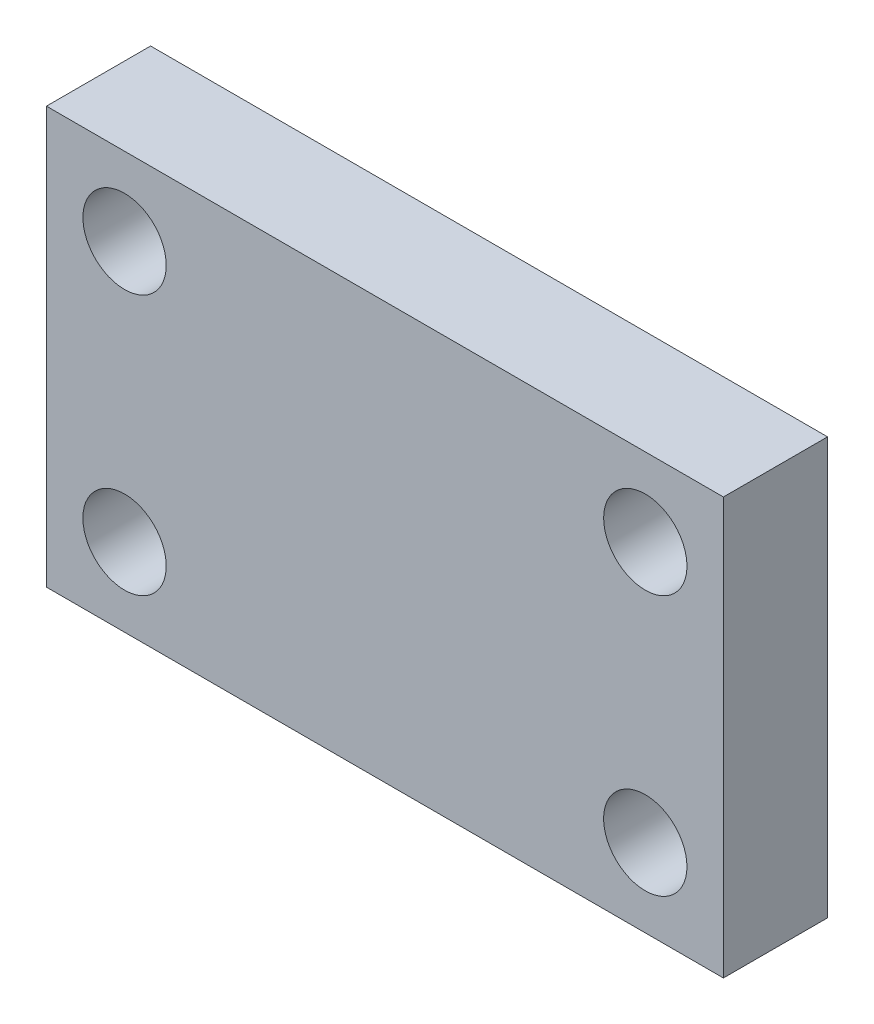
ISO-10303-21;
HEADER;
FILE_DESCRIPTION(('STEP AP214'),'2;1');
FILE_NAME('part.step','',(''),(''),'','','');
FILE_SCHEMA(('AUTOMOTIVE_DESIGN { 1 0 10303 214 1 1 1 1 }'));
ENDSEC;
DATA;
#1=APPLICATION_CONTEXT('core data for automotive mechanical design processes');
#2=APPLICATION_PROTOCOL_DEFINITION('international standard','automotive_design',2000,#1);
#3=PRODUCT_CONTEXT('',#1,'mechanical');
#4=PRODUCT('Part','Part','',(#3));
#5=PRODUCT_RELATED_PRODUCT_CATEGORY('part','',(#4));
#6=PRODUCT_DEFINITION_FORMATION('','',#4);
#7=PRODUCT_DEFINITION_CONTEXT('part definition',#1,'design');
#8=PRODUCT_DEFINITION('design','',#6,#7);
#9=PRODUCT_DEFINITION_SHAPE('','',#8);
#10=(LENGTH_UNIT() NAMED_UNIT(*) SI_UNIT(.MILLI.,.METRE.));
#11=(NAMED_UNIT(*) PLANE_ANGLE_UNIT() SI_UNIT($,.RADIAN.));
#12=(NAMED_UNIT(*) SI_UNIT($,.STERADIAN.) SOLID_ANGLE_UNIT());
#13=UNCERTAINTY_MEASURE_WITH_UNIT(LENGTH_MEASURE(1.E-05),#10,'distance_accuracy_value','');
#14=(GEOMETRIC_REPRESENTATION_CONTEXT(3) GLOBAL_UNCERTAINTY_ASSIGNED_CONTEXT((#13)) GLOBAL_UNIT_ASSIGNED_CONTEXT((#10,
#11,#12)) REPRESENTATION_CONTEXT('',''));
#15=CARTESIAN_POINT('',(0.,0.,0.));
#16=DIRECTION('',(0.,0.,1.));
#17=DIRECTION('',(1.,0.,0.));
#18=AXIS2_PLACEMENT_3D('',#15,#16,#17);
#19=CARTESIAN_POINT('',(0.,0.,20.));
#20=DIRECTION('',(0.,0.,-1.));
#21=DIRECTION('',(-1.,0.,0.));
#22=AXIS2_PLACEMENT_3D('',#19,#20,#21);
#23=PLANE('',#22);
#24=DIRECTION('',(0.,1.,0.));
#25=VECTOR('',#24,1.);
#26=CARTESIAN_POINT('',(65.,-40.,20.));
#27=LINE('',#26,#25);
#28=CARTESIAN_POINT('',(65.,-40.,20.));
#29=VERTEX_POINT('',#28);
#30=CARTESIAN_POINT('',(65.,40.,20.));
#31=VERTEX_POINT('',#30);
#32=EDGE_CURVE('E92',#29,#31,#27,.T.);
#33=ORIENTED_EDGE('',*,*,#32,.T.);
#34=DIRECTION('',(-1.,0.,0.));
#35=VECTOR('',#34,1.);
#36=CARTESIAN_POINT('',(-65.,40.,20.));
#37=LINE('',#36,#35);
#38=CARTESIAN_POINT('',(-65.,40.,20.));
#39=VERTEX_POINT('',#38);
#40=EDGE_CURVE('E87',#31,#39,#37,.T.);
#41=ORIENTED_EDGE('',*,*,#40,.T.);
#42=DIRECTION('',(0.,-1.,0.));
#43=VECTOR('',#42,1.);
#44=CARTESIAN_POINT('',(-65.,-40.,20.));
#45=LINE('',#44,#43);
#46=CARTESIAN_POINT('',(-65.,-40.,20.));
#47=VERTEX_POINT('',#46);
#48=EDGE_CURVE('E90',#39,#47,#45,.T.);
#49=ORIENTED_EDGE('',*,*,#48,.T.);
#50=DIRECTION('',(1.,0.,0.));
#51=VECTOR('',#50,1.);
#52=CARTESIAN_POINT('',(-65.,-40.,20.));
#53=LINE('',#52,#51);
#54=EDGE_CURVE('E57',#47,#29,#53,.T.);
#55=ORIENTED_EDGE('',*,*,#54,.T.);
#56=EDGE_LOOP('',(#33,#41,#49,#55));
#57=FACE_BOUND('',#56,.T.);
#58=CARTESIAN_POINT('',(-50.,25.,20.));
#59=DIRECTION('',(0.,0.,1.));
#60=DIRECTION('',(1.,0.,0.));
#61=AXIS2_PLACEMENT_3D('',#58,#59,#60);
#62=CIRCLE('',#61,8.);
#63=CARTESIAN_POINT('',(-42.,25.,20.));
#64=VERTEX_POINT('',#63);
#65=EDGE_CURVE('E112',#64,#64,#62,.T.);
#66=ORIENTED_EDGE('',*,*,#65,.F.);
#67=EDGE_LOOP('',(#66));
#68=FACE_BOUND('',#67,.T.);
#69=CARTESIAN_POINT('',(50.,25.,20.));
#70=DIRECTION('',(0.,0.,1.));
#71=DIRECTION('',(-1.,0.,0.));
#72=AXIS2_PLACEMENT_3D('',#69,#70,#71);
#73=CIRCLE('',#72,8.);
#74=CARTESIAN_POINT('',(42.,25.,20.));
#75=VERTEX_POINT('',#74);
#76=EDGE_CURVE('E134',#75,#75,#73,.T.);
#77=ORIENTED_EDGE('',*,*,#76,.F.);
#78=EDGE_LOOP('',(#77));
#79=FACE_BOUND('',#78,.T.);
#80=CARTESIAN_POINT('',(50.,-25.,20.));
#81=DIRECTION('',(0.,0.,1.));
#82=DIRECTION('',(1.,0.,0.));
#83=AXIS2_PLACEMENT_3D('',#80,#81,#82);
#84=CIRCLE('',#83,8.);
#85=CARTESIAN_POINT('',(58.,-25.,20.));
#86=VERTEX_POINT('',#85);
#87=EDGE_CURVE('E142',#86,#86,#84,.T.);
#88=ORIENTED_EDGE('',*,*,#87,.F.);
#89=EDGE_LOOP('',(#88));
#90=FACE_BOUND('',#89,.T.);
#91=CARTESIAN_POINT('',(-50.,-25.,20.));
#92=DIRECTION('',(0.,0.,1.));
#93=DIRECTION('',(-1.,0.,0.));
#94=AXIS2_PLACEMENT_3D('',#91,#92,#93);
#95=CIRCLE('',#94,8.);
#96=CARTESIAN_POINT('',(-58.,-25.,20.));
#97=VERTEX_POINT('',#96);
#98=EDGE_CURVE('E150',#97,#97,#95,.T.);
#99=ORIENTED_EDGE('',*,*,#98,.F.);
#100=EDGE_LOOP('',(#99));
#101=FACE_BOUND('',#100,.T.);
#102=ADVANCED_FACE('F39',(#57,#68,#79,#90,#101),#23,.F.);
#103=CARTESIAN_POINT('',(0.,0.,0.));
#104=DIRECTION('',(0.,0.,-1.));
#105=DIRECTION('',(-1.,0.,0.));
#106=AXIS2_PLACEMENT_3D('',#103,#104,#105);
#107=PLANE('',#106);
#108=CARTESIAN_POINT('',(50.,-25.,0.));
#109=DIRECTION('',(0.,0.,1.));
#110=DIRECTION('',(1.,0.,0.));
#111=AXIS2_PLACEMENT_3D('',#108,#109,#110);
#112=CIRCLE('',#111,8.);
#113=CARTESIAN_POINT('',(58.,-25.,0.));
#114=VERTEX_POINT('',#113);
#115=EDGE_CURVE('E146',#114,#114,#112,.T.);
#116=ORIENTED_EDGE('',*,*,#115,.T.);
#117=EDGE_LOOP('',(#116));
#118=FACE_BOUND('',#117,.T.);
#119=CARTESIAN_POINT('',(-50.,25.,0.));
#120=DIRECTION('',(0.,0.,1.));
#121=DIRECTION('',(1.,0.,0.));
#122=AXIS2_PLACEMENT_3D('',#119,#120,#121);
#123=CIRCLE('',#122,8.);
#124=CARTESIAN_POINT('',(-42.,25.,0.));
#125=VERTEX_POINT('',#124);
#126=EDGE_CURVE('E130',#125,#125,#123,.T.);
#127=ORIENTED_EDGE('',*,*,#126,.T.);
#128=EDGE_LOOP('',(#127));
#129=FACE_BOUND('',#128,.T.);
#130=DIRECTION('',(0.,1.,0.));
#131=VECTOR('',#130,1.);
#132=CARTESIAN_POINT('',(65.,-40.,0.));
#133=LINE('',#132,#131);
#134=CARTESIAN_POINT('',(65.,-40.,0.));
#135=VERTEX_POINT('',#134);
#136=CARTESIAN_POINT('',(65.,40.,0.));
#137=VERTEX_POINT('',#136);
#138=EDGE_CURVE('E108',#135,#137,#133,.T.);
#139=ORIENTED_EDGE('',*,*,#138,.F.);
#140=DIRECTION('',(1.,0.,0.));
#141=VECTOR('',#140,1.);
#142=CARTESIAN_POINT('',(-65.,-40.,0.));
#143=LINE('',#142,#141);
#144=CARTESIAN_POINT('',(-65.,-40.,0.));
#145=VERTEX_POINT('',#144);
#146=EDGE_CURVE('E80',#145,#135,#143,.T.);
#147=ORIENTED_EDGE('',*,*,#146,.F.);
#148=DIRECTION('',(0.,-1.,0.));
#149=VECTOR('',#148,1.);
#150=CARTESIAN_POINT('',(-65.,-40.,0.));
#151=LINE('',#150,#149);
#152=CARTESIAN_POINT('',(-65.,40.,0.));
#153=VERTEX_POINT('',#152);
#154=EDGE_CURVE('E74',#153,#145,#151,.T.);
#155=ORIENTED_EDGE('',*,*,#154,.F.);
#156=DIRECTION('',(-1.,0.,0.));
#157=VECTOR('',#156,1.);
#158=CARTESIAN_POINT('',(-65.,40.,0.));
#159=LINE('',#158,#157);
#160=EDGE_CURVE('E97',#137,#153,#159,.T.);
#161=ORIENTED_EDGE('',*,*,#160,.F.);
#162=EDGE_LOOP('',(#139,#147,#155,#161));
#163=FACE_BOUND('',#162,.T.);
#164=CARTESIAN_POINT('',(50.,25.,0.));
#165=DIRECTION('',(0.,0.,1.));
#166=DIRECTION('',(-1.,0.,0.));
#167=AXIS2_PLACEMENT_3D('',#164,#165,#166);
#168=CIRCLE('',#167,8.);
#169=CARTESIAN_POINT('',(42.,25.,0.));
#170=VERTEX_POINT('',#169);
#171=EDGE_CURVE('E138',#170,#170,#168,.T.);
#172=ORIENTED_EDGE('',*,*,#171,.T.);
#173=EDGE_LOOP('',(#172));
#174=FACE_BOUND('',#173,.T.);
#175=CARTESIAN_POINT('',(-50.,-25.,0.));
#176=DIRECTION('',(0.,0.,1.));
#177=DIRECTION('',(-1.,0.,0.));
#178=AXIS2_PLACEMENT_3D('',#175,#176,#177);
#179=CIRCLE('',#178,8.);
#180=CARTESIAN_POINT('',(-58.,-25.,0.));
#181=VERTEX_POINT('',#180);
#182=EDGE_CURVE('E154',#181,#181,#179,.T.);
#183=ORIENTED_EDGE('',*,*,#182,.T.);
#184=EDGE_LOOP('',(#183));
#185=FACE_BOUND('',#184,.T.);
#186=ADVANCED_FACE('F125',(#118,#129,#163,#174,#185),#107,.T.);
#187=CARTESIAN_POINT('',(65.,-40.,20.));
#188=DIRECTION('',(-1.,0.,0.));
#189=DIRECTION('',(0.,0.,1.));
#190=AXIS2_PLACEMENT_3D('',#187,#188,#189);
#191=PLANE('',#190);
#192=ORIENTED_EDGE('',*,*,#138,.T.);
#193=DIRECTION('',(0.,0.,-1.));
#194=VECTOR('',#193,1.);
#195=CARTESIAN_POINT('',(65.,40.,20.));
#196=LINE('',#195,#194);
#197=EDGE_CURVE('E11',#31,#137,#196,.T.);
#198=ORIENTED_EDGE('',*,*,#197,.F.);
#199=ORIENTED_EDGE('',*,*,#32,.F.);
#200=DIRECTION('',(0.,0.,-1.));
#201=VECTOR('',#200,1.);
#202=CARTESIAN_POINT('',(65.,-40.,20.));
#203=LINE('',#202,#201);
#204=EDGE_CURVE('E104',#29,#135,#203,.T.);
#205=ORIENTED_EDGE('',*,*,#204,.T.);
#206=EDGE_LOOP('',(#192,#198,#199,#205));
#207=FACE_BOUND('',#206,.T.);
#208=ADVANCED_FACE('F41',(#207),#191,.F.);
#209=CARTESIAN_POINT('',(-65.,40.,20.));
#210=DIRECTION('',(0.,-1.,0.));
#211=DIRECTION('',(0.,0.,-1.));
#212=AXIS2_PLACEMENT_3D('',#209,#210,#211);
#213=PLANE('',#212);
#214=ORIENTED_EDGE('',*,*,#160,.T.);
#215=DIRECTION('',(0.,0.,-1.));
#216=VECTOR('',#215,1.);
#217=CARTESIAN_POINT('',(-65.,40.,20.));
#218=LINE('',#217,#216);
#219=EDGE_CURVE('E49',#39,#153,#218,.T.);
#220=ORIENTED_EDGE('',*,*,#219,.F.);
#221=ORIENTED_EDGE('',*,*,#40,.F.);
#222=ORIENTED_EDGE('',*,*,#197,.T.);
#223=EDGE_LOOP('',(#214,#220,#221,#222));
#224=FACE_BOUND('',#223,.T.);
#225=ADVANCED_FACE('F96',(#224),#213,.F.);
#226=CARTESIAN_POINT('',(-65.,-40.,20.));
#227=DIRECTION('',(1.,0.,0.));
#228=DIRECTION('',(0.,0.,-1.));
#229=AXIS2_PLACEMENT_3D('',#226,#227,#228);
#230=PLANE('',#229);
#231=ORIENTED_EDGE('',*,*,#154,.T.);
#232=DIRECTION('',(0.,0.,-1.));
#233=VECTOR('',#232,1.);
#234=CARTESIAN_POINT('',(-65.,-40.,20.));
#235=LINE('',#234,#233);
#236=EDGE_CURVE('E99',#47,#145,#235,.T.);
#237=ORIENTED_EDGE('',*,*,#236,.F.);
#238=ORIENTED_EDGE('',*,*,#48,.F.);
#239=ORIENTED_EDGE('',*,*,#219,.T.);
#240=EDGE_LOOP('',(#231,#237,#238,#239));
#241=FACE_BOUND('',#240,.T.);
#242=ADVANCED_FACE('F100',(#241),#230,.F.);
#243=CARTESIAN_POINT('',(-65.,-40.,20.));
#244=DIRECTION('',(0.,1.,0.));
#245=DIRECTION('',(0.,0.,1.));
#246=AXIS2_PLACEMENT_3D('',#243,#244,#245);
#247=PLANE('',#246);
#248=ORIENTED_EDGE('',*,*,#146,.T.);
#249=ORIENTED_EDGE('',*,*,#204,.F.);
#250=ORIENTED_EDGE('',*,*,#54,.F.);
#251=ORIENTED_EDGE('',*,*,#236,.T.);
#252=EDGE_LOOP('',(#248,#249,#250,#251));
#253=FACE_BOUND('',#252,.T.);
#254=ADVANCED_FACE('F122',(#253),#247,.F.);
#255=CARTESIAN_POINT('',(-50.,25.,20.));
#256=DIRECTION('',(0.,0.,-1.));
#257=DIRECTION('',(-1.,0.,0.));
#258=AXIS2_PLACEMENT_3D('',#255,#256,#257);
#259=CYLINDRICAL_SURFACE('',#258,8.);
#260=ORIENTED_EDGE('',*,*,#65,.T.);
#261=EDGE_LOOP('',(#260));
#262=FACE_BOUND('',#261,.T.);
#263=ORIENTED_EDGE('',*,*,#126,.F.);
#264=EDGE_LOOP('',(#263));
#265=FACE_BOUND('',#264,.T.);
#266=ADVANCED_FACE('F173',(#262,#265),#259,.F.);
#267=CARTESIAN_POINT('',(50.,25.,20.));
#268=DIRECTION('',(0.,0.,-1.));
#269=DIRECTION('',(-1.,0.,0.));
#270=AXIS2_PLACEMENT_3D('',#267,#268,#269);
#271=CYLINDRICAL_SURFACE('',#270,8.);
#272=ORIENTED_EDGE('',*,*,#76,.T.);
#273=EDGE_LOOP('',(#272));
#274=FACE_BOUND('',#273,.T.);
#275=ORIENTED_EDGE('',*,*,#171,.F.);
#276=EDGE_LOOP('',(#275));
#277=FACE_BOUND('',#276,.T.);
#278=ADVANCED_FACE('F219',(#274,#277),#271,.F.);
#279=CARTESIAN_POINT('',(50.,-25.,20.));
#280=DIRECTION('',(0.,0.,-1.));
#281=DIRECTION('',(-1.,0.,0.));
#282=AXIS2_PLACEMENT_3D('',#279,#280,#281);
#283=CYLINDRICAL_SURFACE('',#282,8.);
#284=ORIENTED_EDGE('',*,*,#87,.T.);
#285=EDGE_LOOP('',(#284));
#286=FACE_BOUND('',#285,.T.);
#287=ORIENTED_EDGE('',*,*,#115,.F.);
#288=EDGE_LOOP('',(#287));
#289=FACE_BOUND('',#288,.T.);
#290=ADVANCED_FACE('F227',(#286,#289),#283,.F.);
#291=CARTESIAN_POINT('',(-50.,-25.,20.));
#292=DIRECTION('',(0.,0.,-1.));
#293=DIRECTION('',(-1.,0.,0.));
#294=AXIS2_PLACEMENT_3D('',#291,#292,#293);
#295=CYLINDRICAL_SURFACE('',#294,8.);
#296=ORIENTED_EDGE('',*,*,#98,.T.);
#297=EDGE_LOOP('',(#296));
#298=FACE_BOUND('',#297,.T.);
#299=ORIENTED_EDGE('',*,*,#182,.F.);
#300=EDGE_LOOP('',(#299));
#301=FACE_BOUND('',#300,.T.);
#302=ADVANCED_FACE('F162',(#298,#301),#295,.F.);
#303=CLOSED_SHELL('',(#102,#186,#208,#225,#242,#254,#266,#278,#290,#302));
#304=MANIFOLD_SOLID_BREP('B2',#303);
#305=ADVANCED_BREP_SHAPE_REPRESENTATION('',(#18,#304),#14);
#306=SHAPE_DEFINITION_REPRESENTATION(#9,#305);
ENDSEC;
END-ISO-10303-21;
